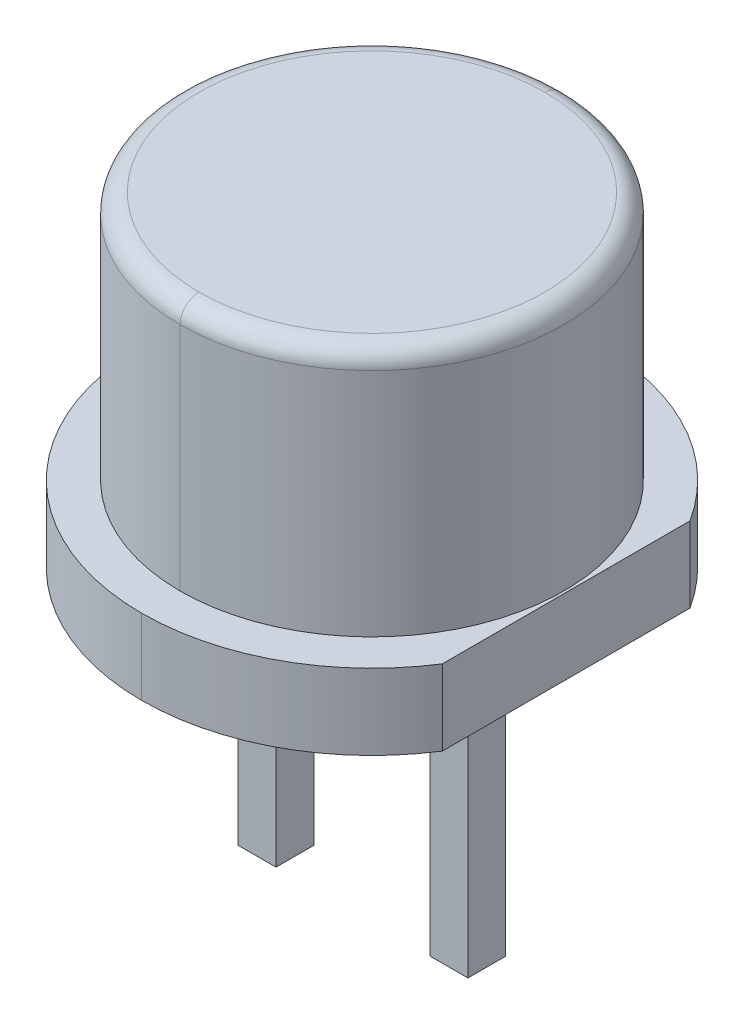
ISO-10303-21;
HEADER;
FILE_DESCRIPTION(('STEP AP214'),'2;1');
FILE_NAME('part.step','',(''),(''),'','','');
FILE_SCHEMA(('AUTOMOTIVE_DESIGN { 1 0 10303 214 1 1 1 1 }'));
ENDSEC;
DATA;
#1=APPLICATION_CONTEXT('core data for automotive mechanical design processes');
#2=APPLICATION_PROTOCOL_DEFINITION('international standard','automotive_design',2000,#1);
#3=PRODUCT_CONTEXT('',#1,'mechanical');
#4=PRODUCT('Part','Part','',(#3));
#5=PRODUCT_RELATED_PRODUCT_CATEGORY('part','',(#4));
#6=PRODUCT_DEFINITION_FORMATION('','',#4);
#7=PRODUCT_DEFINITION_CONTEXT('part definition',#1,'design');
#8=PRODUCT_DEFINITION('design','',#6,#7);
#9=PRODUCT_DEFINITION_SHAPE('','',#8);
#10=(LENGTH_UNIT() NAMED_UNIT(*) SI_UNIT(.MILLI.,.METRE.));
#11=(NAMED_UNIT(*) PLANE_ANGLE_UNIT() SI_UNIT($,.RADIAN.));
#12=(NAMED_UNIT(*) SI_UNIT($,.STERADIAN.) SOLID_ANGLE_UNIT());
#13=UNCERTAINTY_MEASURE_WITH_UNIT(LENGTH_MEASURE(1.E-05),#10,'distance_accuracy_value','');
#14=(GEOMETRIC_REPRESENTATION_CONTEXT(3) GLOBAL_UNCERTAINTY_ASSIGNED_CONTEXT((#13)) GLOBAL_UNIT_ASSIGNED_CONTEXT((#10,
#11,#12)) REPRESENTATION_CONTEXT('',''));
#15=CARTESIAN_POINT('',(0.,0.,0.));
#16=DIRECTION('',(0.,0.,1.));
#17=DIRECTION('',(1.,0.,0.));
#18=AXIS2_PLACEMENT_3D('',#15,#16,#17);
#19=CARTESIAN_POINT('',(0.,10.121968,0.));
#20=DIRECTION('',(0.,-1.,0.));
#21=DIRECTION('',(0.,0.,-1.));
#22=AXIS2_PLACEMENT_3D('',#19,#20,#21);
#23=PLANE('',#22);
#24=CARTESIAN_POINT('',(0.,10.121968,0.));
#25=DIRECTION('',(0.,-1.,0.));
#26=DIRECTION('',(0.,0.,-1.));
#27=AXIS2_PLACEMENT_3D('',#24,#25,#26);
#28=CIRCLE('',#27,2.289876);
#29=CARTESIAN_POINT('',(0.,10.121968,-2.289876));
#30=VERTEX_POINT('',#29);
#31=CARTESIAN_POINT('',(0.,10.121968,2.289876));
#32=VERTEX_POINT('',#31);
#33=EDGE_CURVE('E106',#30,#32,#28,.F.);
#34=ORIENTED_EDGE('',*,*,#33,.T.);
#35=CARTESIAN_POINT('',(0.,10.121968,0.));
#36=DIRECTION('',(0.,-1.,0.));
#37=DIRECTION('',(0.,0.,-1.));
#38=AXIS2_PLACEMENT_3D('',#35,#36,#37);
#39=CIRCLE('',#38,2.289876);
#40=EDGE_CURVE('E97',#32,#30,#39,.F.);
#41=ORIENTED_EDGE('',*,*,#40,.T.);
#42=EDGE_LOOP('',(#34,#41));
#43=FACE_BOUND('',#42,.T.);
#44=ADVANCED_FACE('F87',(#43),#23,.F.);
#45=CARTESIAN_POINT('',(0.,21.1626406871193,0.));
#46=DIRECTION('',(0.,-1.,0.));
#47=DIRECTION('',(0.,0.,-1.));
#48=AXIS2_PLACEMENT_3D('',#45,#46,#47);
#49=CYLINDRICAL_SURFACE('',#48,2.539876);
#50=DIRECTION('',(0.,-1.,0.));
#51=VECTOR('',#50,1.);
#52=CARTESIAN_POINT('',(0.,21.1626406871193,-2.539876));
#53=LINE('',#52,#51);
#54=CARTESIAN_POINT('',(0.,9.871968,-2.539876));
#55=VERTEX_POINT('',#54);
#56=CARTESIAN_POINT('',(0.,6.82,-2.539876));
#57=VERTEX_POINT('',#56);
#58=EDGE_CURVE('E203',#55,#57,#53,.T.);
#59=ORIENTED_EDGE('',*,*,#58,.F.);
#60=CARTESIAN_POINT('',(0.,9.871968,0.));
#61=DIRECTION('',(0.,-1.,0.));
#62=DIRECTION('',(0.,0.,-1.));
#63=AXIS2_PLACEMENT_3D('',#60,#61,#62);
#64=CIRCLE('',#63,2.539876);
#65=CARTESIAN_POINT('',(0.,9.871968,2.539876));
#66=VERTEX_POINT('',#65);
#67=EDGE_CURVE('E228',#55,#66,#64,.T.);
#68=ORIENTED_EDGE('',*,*,#67,.T.);
#69=DIRECTION('',(0.,-1.,0.));
#70=VECTOR('',#69,1.);
#71=CARTESIAN_POINT('',(0.,21.1626406871193,2.539876));
#72=LINE('',#71,#70);
#73=CARTESIAN_POINT('',(0.,6.82,2.539876));
#74=VERTEX_POINT('',#73);
#75=EDGE_CURVE('E219',#66,#74,#72,.T.);
#76=ORIENTED_EDGE('',*,*,#75,.T.);
#77=CARTESIAN_POINT('',(0.,6.82,0.));
#78=DIRECTION('',(0.,1.,0.));
#79=DIRECTION('',(0.,0.,1.));
#80=AXIS2_PLACEMENT_3D('',#77,#78,#79);
#81=CIRCLE('',#80,2.539876);
#82=EDGE_CURVE('E222',#74,#57,#81,.T.);
#83=ORIENTED_EDGE('',*,*,#82,.T.);
#84=EDGE_LOOP('',(#59,#68,#76,#83));
#85=FACE_BOUND('',#84,.T.);
#86=ADVANCED_FACE('F297',(#85),#49,.T.);
#87=CARTESIAN_POINT('',(0.,6.82,0.));
#88=DIRECTION('',(0.,-1.,0.));
#89=DIRECTION('',(0.,0.,-1.));
#90=AXIS2_PLACEMENT_3D('',#87,#88,#89);
#91=CYLINDRICAL_SURFACE('',#90,3.047934);
#92=CARTESIAN_POINT('',(0.,6.82,0.));
#93=DIRECTION('',(0.,1.,0.));
#94=DIRECTION('',(0.,0.,1.));
#95=AXIS2_PLACEMENT_3D('',#92,#93,#94);
#96=CIRCLE('',#95,3.047934);
#97=CARTESIAN_POINT('',(0.,6.82,3.047934));
#98=VERTEX_POINT('',#97);
#99=CARTESIAN_POINT('',(2.57,6.82,1.63859746989796));
#100=VERTEX_POINT('',#99);
#101=EDGE_CURVE('E200',#98,#100,#96,.T.);
#102=ORIENTED_EDGE('',*,*,#101,.F.);
#103=DIRECTION('',(0.,-1.,0.));
#104=VECTOR('',#103,1.);
#105=CARTESIAN_POINT('',(0.,6.82,3.047934));
#106=LINE('',#105,#104);
#107=CARTESIAN_POINT('',(0.,5.82,3.047934));
#108=VERTEX_POINT('',#107);
#109=EDGE_CURVE('E188',#98,#108,#106,.T.);
#110=ORIENTED_EDGE('',*,*,#109,.T.);
#111=CARTESIAN_POINT('',(0.,5.82,0.));
#112=DIRECTION('',(0.,1.,0.));
#113=DIRECTION('',(0.,0.,1.));
#114=AXIS2_PLACEMENT_3D('',#111,#112,#113);
#115=CIRCLE('',#114,3.047934);
#116=CARTESIAN_POINT('',(2.57,5.82,1.63859746989796));
#117=VERTEX_POINT('',#116);
#118=EDGE_CURVE('E196',#108,#117,#115,.T.);
#119=ORIENTED_EDGE('',*,*,#118,.T.);
#120=DIRECTION('',(0.,-1.,0.));
#121=VECTOR('',#120,1.);
#122=CARTESIAN_POINT('',(2.57,6.82,1.63859746989796));
#123=LINE('',#122,#121);
#124=EDGE_CURVE('E191',#100,#117,#123,.T.);
#125=ORIENTED_EDGE('',*,*,#124,.F.);
#126=EDGE_LOOP('',(#102,#110,#119,#125));
#127=FACE_BOUND('',#126,.T.);
#128=ADVANCED_FACE('F292',(#127),#91,.T.);
#129=CARTESIAN_POINT('',(0.,6.82,0.));
#130=DIRECTION('',(0.,-1.,0.));
#131=DIRECTION('',(0.,0.,-1.));
#132=AXIS2_PLACEMENT_3D('',#129,#130,#131);
#133=CYLINDRICAL_SURFACE('',#132,3.047934);
#134=ORIENTED_EDGE('',*,*,#109,.F.);
#135=CARTESIAN_POINT('',(0.,6.82,0.));
#136=DIRECTION('',(0.,1.,0.));
#137=DIRECTION('',(0.,0.,1.));
#138=AXIS2_PLACEMENT_3D('',#135,#136,#137);
#139=CIRCLE('',#138,3.047934);
#140=CARTESIAN_POINT('',(0.,6.82,-3.047934));
#141=VERTEX_POINT('',#140);
#142=EDGE_CURVE('E167',#141,#98,#139,.T.);
#143=ORIENTED_EDGE('',*,*,#142,.F.);
#144=DIRECTION('',(0.,-1.,0.));
#145=VECTOR('',#144,1.);
#146=CARTESIAN_POINT('',(0.,6.82,-3.047934));
#147=LINE('',#146,#145);
#148=CARTESIAN_POINT('',(0.,5.82,-3.047934));
#149=VERTEX_POINT('',#148);
#150=EDGE_CURVE('E178',#141,#149,#147,.T.);
#151=ORIENTED_EDGE('',*,*,#150,.T.);
#152=CARTESIAN_POINT('',(0.,5.82,0.));
#153=DIRECTION('',(0.,1.,0.));
#154=DIRECTION('',(0.,0.,1.));
#155=AXIS2_PLACEMENT_3D('',#152,#153,#154);
#156=CIRCLE('',#155,3.047934);
#157=EDGE_CURVE('E175',#149,#108,#156,.T.);
#158=ORIENTED_EDGE('',*,*,#157,.T.);
#159=EDGE_LOOP('',(#134,#143,#151,#158));
#160=FACE_BOUND('',#159,.T.);
#161=ADVANCED_FACE('F186',(#160),#133,.T.);
#162=CARTESIAN_POINT('',(0.,6.82,0.));
#163=DIRECTION('',(0.,-1.,0.));
#164=DIRECTION('',(0.,0.,-1.));
#165=AXIS2_PLACEMENT_3D('',#162,#163,#164);
#166=CYLINDRICAL_SURFACE('',#165,3.047934);
#167=ORIENTED_EDGE('',*,*,#150,.F.);
#168=CARTESIAN_POINT('',(0.,6.82,0.));
#169=DIRECTION('',(0.,1.,0.));
#170=DIRECTION('',(0.,0.,1.));
#171=AXIS2_PLACEMENT_3D('',#168,#169,#170);
#172=CIRCLE('',#171,3.047934);
#173=CARTESIAN_POINT('',(2.57,6.82,-1.63859746989796));
#174=VERTEX_POINT('',#173);
#175=EDGE_CURVE('E162',#174,#141,#172,.T.);
#176=ORIENTED_EDGE('',*,*,#175,.F.);
#177=DIRECTION('',(0.,-1.,0.));
#178=VECTOR('',#177,1.);
#179=CARTESIAN_POINT('',(2.57,6.82,-1.63859746989796));
#180=LINE('',#179,#178);
#181=CARTESIAN_POINT('',(2.57,5.82,-1.63859746989796));
#182=VERTEX_POINT('',#181);
#183=EDGE_CURVE('E174',#174,#182,#180,.T.);
#184=ORIENTED_EDGE('',*,*,#183,.T.);
#185=CARTESIAN_POINT('',(0.,5.82,0.));
#186=DIRECTION('',(0.,1.,0.));
#187=DIRECTION('',(0.,0.,1.));
#188=AXIS2_PLACEMENT_3D('',#185,#186,#187);
#189=CIRCLE('',#188,3.047934);
#190=EDGE_CURVE('E181',#182,#149,#189,.T.);
#191=ORIENTED_EDGE('',*,*,#190,.T.);
#192=EDGE_LOOP('',(#167,#176,#184,#191));
#193=FACE_BOUND('',#192,.T.);
#194=ADVANCED_FACE('F179',(#193),#166,.T.);
#195=CARTESIAN_POINT('',(2.57,6.82,-1.1811964273566));
#196=DIRECTION('',(-1.,0.,0.));
#197=DIRECTION('',(0.,0.,1.));
#198=AXIS2_PLACEMENT_3D('',#195,#196,#197);
#199=PLANE('',#198);
#200=DIRECTION('',(0.,0.,-1.));
#201=VECTOR('',#200,1.);
#202=CARTESIAN_POINT('',(2.57,5.82,-1.1811964273566));
#203=LINE('',#202,#201);
#204=EDGE_CURVE('E211',#117,#182,#203,.T.);
#205=ORIENTED_EDGE('',*,*,#204,.T.);
#206=ORIENTED_EDGE('',*,*,#183,.F.);
#207=DIRECTION('',(0.,0.,-1.));
#208=VECTOR('',#207,1.);
#209=CARTESIAN_POINT('',(2.57,6.82,-1.1811964273566));
#210=LINE('',#209,#208);
#211=EDGE_CURVE('E169',#100,#174,#210,.T.);
#212=ORIENTED_EDGE('',*,*,#211,.F.);
#213=ORIENTED_EDGE('',*,*,#124,.T.);
#214=EDGE_LOOP('',(#205,#206,#212,#213));
#215=FACE_BOUND('',#214,.T.);
#216=ADVANCED_FACE('F332',(#215),#199,.F.);
#217=CARTESIAN_POINT('',(0.,6.82,0.));
#218=DIRECTION('',(0.,1.,0.));
#219=DIRECTION('',(1.,0.,0.));
#220=AXIS2_PLACEMENT_3D('',#217,#218,#219);
#221=PLANE('',#220);
#222=CARTESIAN_POINT('',(0.,6.82,0.));
#223=DIRECTION('',(0.,1.,0.));
#224=DIRECTION('',(0.,0.,1.));
#225=AXIS2_PLACEMENT_3D('',#222,#223,#224);
#226=CIRCLE('',#225,2.539876);
#227=EDGE_CURVE('E216',#57,#74,#226,.T.);
#228=ORIENTED_EDGE('',*,*,#227,.F.);
#229=ORIENTED_EDGE('',*,*,#82,.F.);
#230=EDGE_LOOP('',(#228,#229));
#231=FACE_BOUND('',#230,.T.);
#232=ORIENTED_EDGE('',*,*,#175,.T.);
#233=ORIENTED_EDGE('',*,*,#142,.T.);
#234=ORIENTED_EDGE('',*,*,#101,.T.);
#235=ORIENTED_EDGE('',*,*,#211,.T.);
#236=EDGE_LOOP('',(#232,#233,#234,#235));
#237=FACE_BOUND('',#236,.T.);
#238=ADVANCED_FACE('F164',(#231,#237),#221,.T.);
#239=CARTESIAN_POINT('',(0.,5.82,0.));
#240=DIRECTION('',(0.,1.,0.));
#241=DIRECTION('',(1.,0.,0.));
#242=AXIS2_PLACEMENT_3D('',#239,#240,#241);
#243=PLANE('',#242);
#244=ORIENTED_EDGE('',*,*,#190,.F.);
#245=ORIENTED_EDGE('',*,*,#204,.F.);
#246=ORIENTED_EDGE('',*,*,#118,.F.);
#247=ORIENTED_EDGE('',*,*,#157,.F.);
#248=EDGE_LOOP('',(#244,#245,#246,#247));
#249=FACE_BOUND('',#248,.T.);
#250=ADVANCED_FACE('F306',(#249),#243,.F.);
#251=CARTESIAN_POINT('',(0.,21.1626406871193,0.));
#252=DIRECTION('',(0.,-1.,0.));
#253=DIRECTION('',(0.,0.,-1.));
#254=AXIS2_PLACEMENT_3D('',#251,#252,#253);
#255=CYLINDRICAL_SURFACE('',#254,2.539876);
#256=ORIENTED_EDGE('',*,*,#75,.F.);
#257=CARTESIAN_POINT('',(0.,9.871968,0.));
#258=DIRECTION('',(0.,-1.,0.));
#259=DIRECTION('',(0.,0.,-1.));
#260=AXIS2_PLACEMENT_3D('',#257,#258,#259);
#261=CIRCLE('',#260,2.539876);
#262=EDGE_CURVE('E14',#66,#55,#261,.T.);
#263=ORIENTED_EDGE('',*,*,#262,.T.);
#264=ORIENTED_EDGE('',*,*,#58,.T.);
#265=ORIENTED_EDGE('',*,*,#227,.T.);
#266=EDGE_LOOP('',(#256,#263,#264,#265));
#267=FACE_BOUND('',#266,.T.);
#268=ADVANCED_FACE('F310',(#267),#255,.T.);
#269=CARTESIAN_POINT('',(0.,9.871968,0.));
#270=DIRECTION('',(0.,-1.,0.));
#271=DIRECTION('',(0.,0.,-1.));
#272=AXIS2_PLACEMENT_3D('',#269,#270,#271);
#273=TOROIDAL_SURFACE('',#272,2.289876,0.25);
#274=CARTESIAN_POINT('',(0.,9.871968,2.289876));
#275=DIRECTION('',(1.,0.,0.));
#276=DIRECTION('',(0.,0.,-1.));
#277=AXIS2_PLACEMENT_3D('',#274,#275,#276);
#278=CIRCLE('',#277,0.25);
#279=EDGE_CURVE('E238',#32,#66,#278,.T.);
#280=ORIENTED_EDGE('',*,*,#279,.F.);
#281=ORIENTED_EDGE('',*,*,#33,.F.);
#282=CARTESIAN_POINT('',(0.,9.871968,-2.289876));
#283=DIRECTION('',(1.,0.,0.));
#284=DIRECTION('',(0.,0.,-1.));
#285=AXIS2_PLACEMENT_3D('',#282,#283,#284);
#286=CIRCLE('',#285,0.25);
#287=EDGE_CURVE('E91',#55,#30,#286,.T.);
#288=ORIENTED_EDGE('',*,*,#287,.F.);
#289=ORIENTED_EDGE('',*,*,#262,.F.);
#290=EDGE_LOOP('',(#280,#281,#288,#289));
#291=FACE_BOUND('',#290,.T.);
#292=ADVANCED_FACE('F89',(#291),#273,.T.);
#293=CARTESIAN_POINT('',(0.,9.871968,0.));
#294=DIRECTION('',(0.,-1.,0.));
#295=DIRECTION('',(0.,0.,-1.));
#296=AXIS2_PLACEMENT_3D('',#293,#294,#295);
#297=TOROIDAL_SURFACE('',#296,2.289876,0.25);
#298=ORIENTED_EDGE('',*,*,#287,.T.);
#299=ORIENTED_EDGE('',*,*,#40,.F.);
#300=ORIENTED_EDGE('',*,*,#279,.T.);
#301=ORIENTED_EDGE('',*,*,#67,.F.);
#302=EDGE_LOOP('',(#298,#299,#300,#301));
#303=FACE_BOUND('',#302,.T.);
#304=ADVANCED_FACE('F453',(#303),#297,.T.);
#305=CLOSED_SHELL('',(#44,#86,#128,#161,#194,#216,#238,#250,#268,#292,#304));
#306=MANIFOLD_SOLID_BREP('B2',#305);
#307=CARTESIAN_POINT('',(0.,0.,-0.25));
#308=DIRECTION('',(0.,0.,1.));
#309=DIRECTION('',(1.,0.,0.));
#310=AXIS2_PLACEMENT_3D('',#307,#308,#309);
#311=PLANE('',#310);
#312=DIRECTION('',(0.,1.,0.));
#313=VECTOR('',#312,1.);
#314=CARTESIAN_POINT('',(-1.02,1.,-0.25));
#315=LINE('',#314,#313);
#316=CARTESIAN_POINT('',(-1.02,2.,-0.25));
#317=VERTEX_POINT('',#316);
#318=CARTESIAN_POINT('',(-1.02,5.82,-0.25));
#319=VERTEX_POINT('',#318);
#320=EDGE_CURVE('E572',#317,#319,#315,.T.);
#321=ORIENTED_EDGE('',*,*,#320,.F.);
#322=DIRECTION('',(-1.,0.,0.));
#323=VECTOR('',#322,1.);
#324=CARTESIAN_POINT('',(0.,2.,-0.25));
#325=LINE('',#324,#323);
#326=CARTESIAN_POINT('',(-1.52,2.,-0.25));
#327=VERTEX_POINT('',#326);
#328=EDGE_CURVE('E562',#317,#327,#325,.T.);
#329=ORIENTED_EDGE('',*,*,#328,.T.);
#330=DIRECTION('',(0.,-1.,0.));
#331=VECTOR('',#330,1.);
#332=CARTESIAN_POINT('',(-1.52,5.82,-0.25));
#333=LINE('',#332,#331);
#334=CARTESIAN_POINT('',(-1.52,5.82,-0.25));
#335=VERTEX_POINT('',#334);
#336=EDGE_CURVE('E570',#335,#327,#333,.T.);
#337=ORIENTED_EDGE('',*,*,#336,.F.);
#338=DIRECTION('',(-1.,0.,0.));
#339=VECTOR('',#338,1.);
#340=CARTESIAN_POINT('',(-1.02,5.82,-0.25));
#341=LINE('',#340,#339);
#342=EDGE_CURVE('E593',#319,#335,#341,.T.);
#343=ORIENTED_EDGE('',*,*,#342,.F.);
#344=EDGE_LOOP('',(#321,#329,#337,#343));
#345=FACE_BOUND('',#344,.T.);
#346=ADVANCED_FACE('F514',(#345),#311,.F.);
#347=CARTESIAN_POINT('',(0.,0.,0.25));
#348=DIRECTION('',(0.,0.,1.));
#349=DIRECTION('',(1.,0.,0.));
#350=AXIS2_PLACEMENT_3D('',#347,#348,#349);
#351=PLANE('',#350);
#352=DIRECTION('',(-1.,0.,0.));
#353=VECTOR('',#352,1.);
#354=CARTESIAN_POINT('',(0.,2.,0.25));
#355=LINE('',#354,#353);
#356=CARTESIAN_POINT('',(-1.02,2.,0.25));
#357=VERTEX_POINT('',#356);
#358=CARTESIAN_POINT('',(-1.52,2.,0.25));
#359=VERTEX_POINT('',#358);
#360=EDGE_CURVE('E531',#357,#359,#355,.T.);
#361=ORIENTED_EDGE('',*,*,#360,.F.);
#362=DIRECTION('',(0.,1.,0.));
#363=VECTOR('',#362,1.);
#364=CARTESIAN_POINT('',(-1.02,1.,0.25));
#365=LINE('',#364,#363);
#366=CARTESIAN_POINT('',(-1.02,5.82,0.25));
#367=VERTEX_POINT('',#366);
#368=EDGE_CURVE('E522',#357,#367,#365,.T.);
#369=ORIENTED_EDGE('',*,*,#368,.T.);
#370=DIRECTION('',(-1.,0.,0.));
#371=VECTOR('',#370,1.);
#372=CARTESIAN_POINT('',(-1.02,5.82,0.25));
#373=LINE('',#372,#371);
#374=CARTESIAN_POINT('',(-1.52,5.82,0.25));
#375=VERTEX_POINT('',#374);
#376=EDGE_CURVE('E590',#367,#375,#373,.T.);
#377=ORIENTED_EDGE('',*,*,#376,.T.);
#378=DIRECTION('',(0.,-1.,0.));
#379=VECTOR('',#378,1.);
#380=CARTESIAN_POINT('',(-1.52,5.82,0.25));
#381=LINE('',#380,#379);
#382=EDGE_CURVE('E581',#375,#359,#381,.T.);
#383=ORIENTED_EDGE('',*,*,#382,.T.);
#384=EDGE_LOOP('',(#361,#369,#377,#383));
#385=FACE_BOUND('',#384,.T.);
#386=ADVANCED_FACE('F627',(#385),#351,.T.);
#387=CARTESIAN_POINT('',(-1.02,1.,0.25));
#388=DIRECTION('',(-1.,0.,0.));
#389=DIRECTION('',(0.,1.,0.));
#390=AXIS2_PLACEMENT_3D('',#387,#388,#389);
#391=PLANE('',#390);
#392=ORIENTED_EDGE('',*,*,#368,.F.);
#393=DIRECTION('',(0.,0.,-1.));
#394=VECTOR('',#393,1.);
#395=CARTESIAN_POINT('',(-1.02,2.,0.25));
#396=LINE('',#395,#394);
#397=EDGE_CURVE('E574',#357,#317,#396,.T.);
#398=ORIENTED_EDGE('',*,*,#397,.T.);
#399=ORIENTED_EDGE('',*,*,#320,.T.);
#400=DIRECTION('',(0.,0.,-1.));
#401=VECTOR('',#400,1.);
#402=CARTESIAN_POINT('',(-1.02,5.82,0.25));
#403=LINE('',#402,#401);
#404=EDGE_CURVE('E582',#367,#319,#403,.T.);
#405=ORIENTED_EDGE('',*,*,#404,.F.);
#406=EDGE_LOOP('',(#392,#398,#399,#405));
#407=FACE_BOUND('',#406,.T.);
#408=ADVANCED_FACE('F621',(#407),#391,.F.);
#409=CARTESIAN_POINT('',(-1.52,5.82,0.25));
#410=DIRECTION('',(1.,0.,0.));
#411=DIRECTION('',(0.,1.,0.));
#412=AXIS2_PLACEMENT_3D('',#409,#410,#411);
#413=PLANE('',#412);
#414=ORIENTED_EDGE('',*,*,#336,.T.);
#415=DIRECTION('',(0.,0.,1.));
#416=VECTOR('',#415,1.);
#417=CARTESIAN_POINT('',(-1.52,2.,0.25));
#418=LINE('',#417,#416);
#419=EDGE_CURVE('E85',#327,#359,#418,.T.);
#420=ORIENTED_EDGE('',*,*,#419,.T.);
#421=ORIENTED_EDGE('',*,*,#382,.F.);
#422=DIRECTION('',(0.,0.,-1.));
#423=VECTOR('',#422,1.);
#424=CARTESIAN_POINT('',(-1.52,5.82,0.25));
#425=LINE('',#424,#423);
#426=EDGE_CURVE('E578',#375,#335,#425,.T.);
#427=ORIENTED_EDGE('',*,*,#426,.T.);
#428=EDGE_LOOP('',(#414,#420,#421,#427));
#429=FACE_BOUND('',#428,.T.);
#430=ADVANCED_FACE('F576',(#429),#413,.F.);
#431=CARTESIAN_POINT('',(-1.02,5.82,0.25));
#432=DIRECTION('',(0.,-1.,0.));
#433=DIRECTION('',(0.,0.,-1.));
#434=AXIS2_PLACEMENT_3D('',#431,#432,#433);
#435=PLANE('',#434);
#436=ORIENTED_EDGE('',*,*,#342,.T.);
#437=ORIENTED_EDGE('',*,*,#426,.F.);
#438=ORIENTED_EDGE('',*,*,#376,.F.);
#439=ORIENTED_EDGE('',*,*,#404,.T.);
#440=EDGE_LOOP('',(#436,#437,#438,#439));
#441=FACE_BOUND('',#440,.T.);
#442=ADVANCED_FACE('F620',(#441),#435,.F.);
#443=CARTESIAN_POINT('',(0.,2.,0.));
#444=DIRECTION('',(0.,1.,0.));
#445=DIRECTION('',(0.,0.,1.));
#446=AXIS2_PLACEMENT_3D('',#443,#444,#445);
#447=PLANE('',#446);
#448=ORIENTED_EDGE('',*,*,#360,.T.);
#449=ORIENTED_EDGE('',*,*,#419,.F.);
#450=ORIENTED_EDGE('',*,*,#328,.F.);
#451=ORIENTED_EDGE('',*,*,#397,.F.);
#452=EDGE_LOOP('',(#448,#449,#450,#451));
#453=FACE_BOUND('',#452,.T.);
#454=ADVANCED_FACE('F561',(#453),#447,.F.);
#455=CLOSED_SHELL('',(#346,#386,#408,#430,#442,#454));
#456=MANIFOLD_SOLID_BREP('B8',#455);
#457=CARTESIAN_POINT('',(0.,0.,-0.25));
#458=DIRECTION('',(0.,0.,-1.));
#459=DIRECTION('',(0.,-1.,0.));
#460=AXIS2_PLACEMENT_3D('',#457,#458,#459);
#461=PLANE('',#460);
#462=DIRECTION('',(1.,0.,0.));
#463=VECTOR('',#462,1.);
#464=CARTESIAN_POINT('',(0.,2.,-0.25));
#465=LINE('',#464,#463);
#466=CARTESIAN_POINT('',(1.02,2.,-0.25));
#467=VERTEX_POINT('',#466);
#468=CARTESIAN_POINT('',(1.52,2.,-0.25));
#469=VERTEX_POINT('',#468);
#470=EDGE_CURVE('E768',#467,#469,#465,.T.);
#471=ORIENTED_EDGE('',*,*,#470,.F.);
#472=DIRECTION('',(0.,-1.,0.));
#473=VECTOR('',#472,1.);
#474=CARTESIAN_POINT('',(1.02,1.,-0.25));
#475=LINE('',#474,#473);
#476=CARTESIAN_POINT('',(1.02,5.82,-0.25));
#477=VERTEX_POINT('',#476);
#478=EDGE_CURVE('E750',#477,#467,#475,.T.);
#479=ORIENTED_EDGE('',*,*,#478,.F.);
#480=DIRECTION('',(-1.,0.,0.));
#481=VECTOR('',#480,1.);
#482=CARTESIAN_POINT('',(1.02,5.82,-0.25));
#483=LINE('',#482,#481);
#484=CARTESIAN_POINT('',(1.52,5.82,-0.25));
#485=VERTEX_POINT('',#484);
#486=EDGE_CURVE('E737',#485,#477,#483,.T.);
#487=ORIENTED_EDGE('',*,*,#486,.F.);
#488=DIRECTION('',(0.,1.,0.));
#489=VECTOR('',#488,1.);
#490=CARTESIAN_POINT('',(1.52,5.82,-0.25));
#491=LINE('',#490,#489);
#492=EDGE_CURVE('E746',#469,#485,#491,.T.);
#493=ORIENTED_EDGE('',*,*,#492,.F.);
#494=EDGE_LOOP('',(#471,#479,#487,#493));
#495=FACE_BOUND('',#494,.T.);
#496=ADVANCED_FACE('F687',(#495),#461,.T.);
#497=CARTESIAN_POINT('',(0.,0.,0.25));
#498=DIRECTION('',(0.,0.,-1.));
#499=DIRECTION('',(0.,-1.,0.));
#500=AXIS2_PLACEMENT_3D('',#497,#498,#499);
#501=PLANE('',#500);
#502=DIRECTION('',(0.,-1.,0.));
#503=VECTOR('',#502,1.);
#504=CARTESIAN_POINT('',(1.02,1.,0.25));
#505=LINE('',#504,#503);
#506=CARTESIAN_POINT('',(1.02,5.82,0.25));
#507=VERTEX_POINT('',#506);
#508=CARTESIAN_POINT('',(1.02,2.,0.25));
#509=VERTEX_POINT('',#508);
#510=EDGE_CURVE('E732',#507,#509,#505,.T.);
#511=ORIENTED_EDGE('',*,*,#510,.T.);
#512=DIRECTION('',(1.,0.,0.));
#513=VECTOR('',#512,1.);
#514=CARTESIAN_POINT('',(0.,2.,0.25));
#515=LINE('',#514,#513);
#516=CARTESIAN_POINT('',(1.52,2.,0.25));
#517=VERTEX_POINT('',#516);
#518=EDGE_CURVE('E703',#509,#517,#515,.T.);
#519=ORIENTED_EDGE('',*,*,#518,.T.);
#520=DIRECTION('',(0.,1.,0.));
#521=VECTOR('',#520,1.);
#522=CARTESIAN_POINT('',(1.52,5.82,0.25));
#523=LINE('',#522,#521);
#524=CARTESIAN_POINT('',(1.52,5.82,0.25));
#525=VERTEX_POINT('',#524);
#526=EDGE_CURVE('E713',#517,#525,#523,.T.);
#527=ORIENTED_EDGE('',*,*,#526,.T.);
#528=DIRECTION('',(-1.,0.,0.));
#529=VECTOR('',#528,1.);
#530=CARTESIAN_POINT('',(1.02,5.82,0.25));
#531=LINE('',#530,#529);
#532=EDGE_CURVE('E696',#525,#507,#531,.T.);
#533=ORIENTED_EDGE('',*,*,#532,.T.);
#534=EDGE_LOOP('',(#511,#519,#527,#533));
#535=FACE_BOUND('',#534,.T.);
#536=ADVANCED_FACE('F730',(#535),#501,.F.);
#537=CARTESIAN_POINT('',(1.02,5.82,0.25));
#538=DIRECTION('',(0.,-1.,0.));
#539=DIRECTION('',(0.,0.,-1.));
#540=AXIS2_PLACEMENT_3D('',#537,#538,#539);
#541=PLANE('',#540);
#542=ORIENTED_EDGE('',*,*,#486,.T.);
#543=DIRECTION('',(0.,0.,-1.));
#544=VECTOR('',#543,1.);
#545=CARTESIAN_POINT('',(1.02,5.82,0.25));
#546=LINE('',#545,#544);
#547=EDGE_CURVE('E740',#507,#477,#546,.T.);
#548=ORIENTED_EDGE('',*,*,#547,.F.);
#549=ORIENTED_EDGE('',*,*,#532,.F.);
#550=DIRECTION('',(0.,0.,-1.));
#551=VECTOR('',#550,1.);
#552=CARTESIAN_POINT('',(1.52,5.82,0.25));
#553=LINE('',#552,#551);
#554=EDGE_CURVE('E756',#525,#485,#553,.T.);
#555=ORIENTED_EDGE('',*,*,#554,.T.);
#556=EDGE_LOOP('',(#542,#548,#549,#555));
#557=FACE_BOUND('',#556,.T.);
#558=ADVANCED_FACE('F689',(#557),#541,.F.);
#559=CARTESIAN_POINT('',(1.52,5.82,0.25));
#560=DIRECTION('',(-1.,0.,0.));
#561=DIRECTION('',(0.,0.,1.));
#562=AXIS2_PLACEMENT_3D('',#559,#560,#561);
#563=PLANE('',#562);
#564=ORIENTED_EDGE('',*,*,#526,.F.);
#565=DIRECTION('',(0.,0.,-1.));
#566=VECTOR('',#565,1.);
#567=CARTESIAN_POINT('',(1.52,2.,0.25));
#568=LINE('',#567,#566);
#569=EDGE_CURVE('E753',#517,#469,#568,.T.);
#570=ORIENTED_EDGE('',*,*,#569,.T.);
#571=ORIENTED_EDGE('',*,*,#492,.T.);
#572=ORIENTED_EDGE('',*,*,#554,.F.);
#573=EDGE_LOOP('',(#564,#570,#571,#572));
#574=FACE_BOUND('',#573,.T.);
#575=ADVANCED_FACE('F775',(#574),#563,.F.);
#576=CARTESIAN_POINT('',(1.02,1.,0.25));
#577=DIRECTION('',(1.,0.,0.));
#578=DIRECTION('',(0.,-1.,0.));
#579=AXIS2_PLACEMENT_3D('',#576,#577,#578);
#580=PLANE('',#579);
#581=ORIENTED_EDGE('',*,*,#478,.T.);
#582=DIRECTION('',(0.,0.,1.));
#583=VECTOR('',#582,1.);
#584=CARTESIAN_POINT('',(1.02,2.,0.25));
#585=LINE('',#584,#583);
#586=EDGE_CURVE('E512',#467,#509,#585,.T.);
#587=ORIENTED_EDGE('',*,*,#586,.T.);
#588=ORIENTED_EDGE('',*,*,#510,.F.);
#589=ORIENTED_EDGE('',*,*,#547,.T.);
#590=EDGE_LOOP('',(#581,#587,#588,#589));
#591=FACE_BOUND('',#590,.T.);
#592=ADVANCED_FACE('F748',(#591),#580,.F.);
#593=CARTESIAN_POINT('',(0.,2.,0.));
#594=DIRECTION('',(0.,1.,0.));
#595=DIRECTION('',(0.,0.,1.));
#596=AXIS2_PLACEMENT_3D('',#593,#594,#595);
#597=PLANE('',#596);
#598=ORIENTED_EDGE('',*,*,#518,.F.);
#599=ORIENTED_EDGE('',*,*,#586,.F.);
#600=ORIENTED_EDGE('',*,*,#470,.T.);
#601=ORIENTED_EDGE('',*,*,#569,.F.);
#602=EDGE_LOOP('',(#598,#599,#600,#601));
#603=FACE_BOUND('',#602,.T.);
#604=ADVANCED_FACE('F781',(#603),#597,.F.);
#605=CLOSED_SHELL('',(#496,#536,#558,#575,#592,#604));
#606=MANIFOLD_SOLID_BREP('B79',#605);
#607=ADVANCED_BREP_SHAPE_REPRESENTATION('',(#18,#306,#456,#606),#14);
#608=SHAPE_DEFINITION_REPRESENTATION(#9,#607);
ENDSEC;
END-ISO-10303-21;
